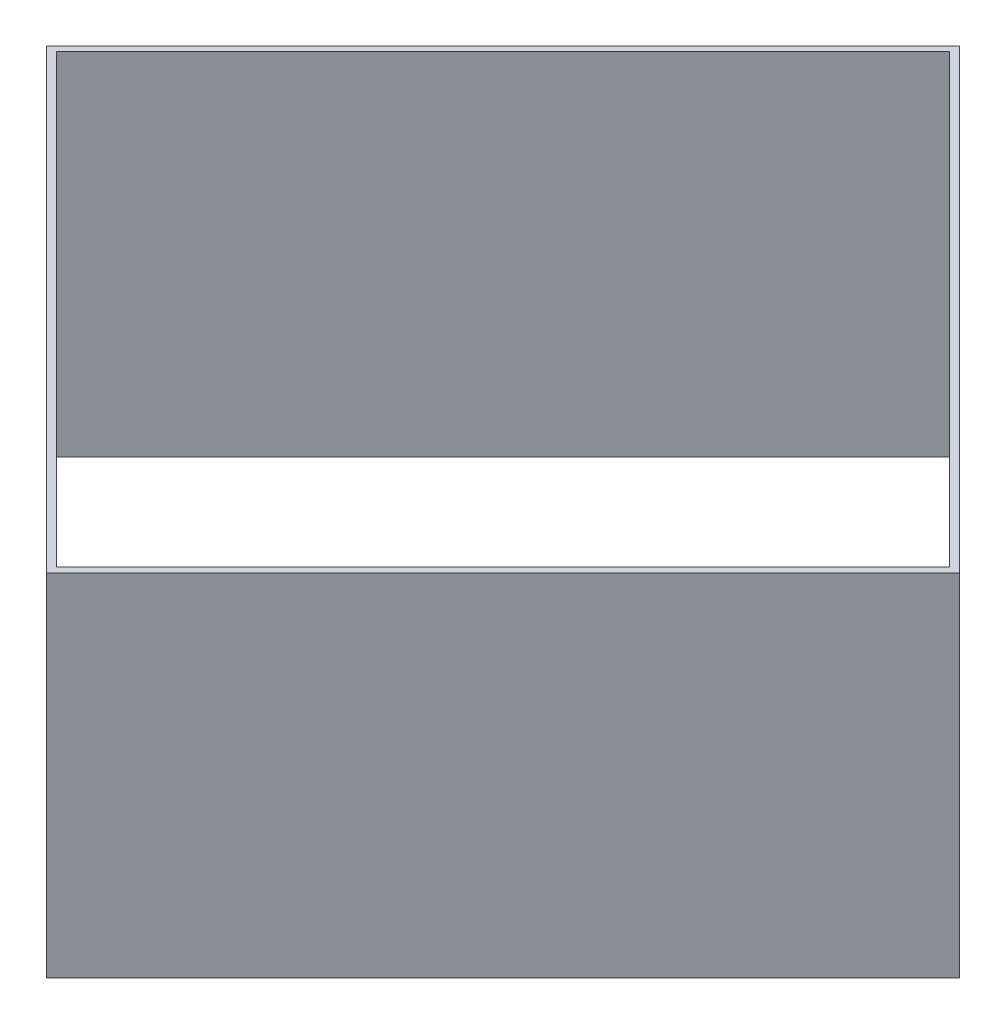
ISO-10303-21;
HEADER;
FILE_DESCRIPTION(('STEP AP214'),'2;1');
FILE_NAME('part.step','',(''),(''),'','','');
FILE_SCHEMA(('AUTOMOTIVE_DESIGN { 1 0 10303 214 1 1 1 1 }'));
ENDSEC;
DATA;
#1=APPLICATION_CONTEXT('core data for automotive mechanical design processes');
#2=APPLICATION_PROTOCOL_DEFINITION('international standard','automotive_design',2000,#1);
#3=PRODUCT_CONTEXT('',#1,'mechanical');
#4=PRODUCT('Part','Part','',(#3));
#5=PRODUCT_RELATED_PRODUCT_CATEGORY('part','',(#4));
#6=PRODUCT_DEFINITION_FORMATION('','',#4);
#7=PRODUCT_DEFINITION_CONTEXT('part definition',#1,'design');
#8=PRODUCT_DEFINITION('design','',#6,#7);
#9=PRODUCT_DEFINITION_SHAPE('','',#8);
#10=(LENGTH_UNIT() NAMED_UNIT(*) SI_UNIT(.MILLI.,.METRE.));
#11=(NAMED_UNIT(*) PLANE_ANGLE_UNIT() SI_UNIT($,.RADIAN.));
#12=(NAMED_UNIT(*) SI_UNIT($,.STERADIAN.) SOLID_ANGLE_UNIT());
#13=UNCERTAINTY_MEASURE_WITH_UNIT(LENGTH_MEASURE(1.E-05),#10,'distance_accuracy_value','');
#14=(GEOMETRIC_REPRESENTATION_CONTEXT(3) GLOBAL_UNCERTAINTY_ASSIGNED_CONTEXT((#13)) GLOBAL_UNIT_ASSIGNED_CONTEXT((#10,
#11,#12)) REPRESENTATION_CONTEXT('',''));
#15=CARTESIAN_POINT('',(0.,0.,0.));
#16=DIRECTION('',(0.,0.,1.));
#17=DIRECTION('',(1.,0.,0.));
#18=AXIS2_PLACEMENT_3D('',#15,#16,#17);
#19=CARTESIAN_POINT('',(0.,10.,0.));
#20=DIRECTION('',(0.,1.,0.));
#21=DIRECTION('',(0.,0.,1.));
#22=AXIS2_PLACEMENT_3D('',#19,#20,#21);
#23=PLANE('',#22);
#24=DIRECTION('',(0.707106781186547,0.,-0.707106781186548));
#25=VECTOR('',#24,1.);
#26=CARTESIAN_POINT('',(0.14142135623731,10.,12.8693434175952));
#27=LINE('',#26,#25);
#28=CARTESIAN_POINT('',(0.,10.,13.0107647738325));
#29=VERTEX_POINT('',#28);
#30=CARTESIAN_POINT('',(13.0107647738325,10.,0.));
#31=VERTEX_POINT('',#30);
#32=EDGE_CURVE('E160',#29,#31,#27,.T.);
#33=ORIENTED_EDGE('',*,*,#32,.T.);
#34=DIRECTION('',(-0.707106781186548,0.,-0.707106781186547));
#35=VECTOR('',#34,1.);
#36=CARTESIAN_POINT('',(12.8693434175952,10.,-0.141421356237309));
#37=LINE('',#36,#35);
#38=CARTESIAN_POINT('',(0.,10.,-13.0107647738325));
#39=VERTEX_POINT('',#38);
#40=EDGE_CURVE('E163',#31,#39,#37,.T.);
#41=ORIENTED_EDGE('',*,*,#40,.T.);
#42=DIRECTION('',(-0.707106781186548,0.,0.707106781186547));
#43=VECTOR('',#42,1.);
#44=CARTESIAN_POINT('',(-12.8693434175952,10.,-0.141421356237309));
#45=LINE('',#44,#43);
#46=CARTESIAN_POINT('',(-13.0107647738325,10.,0.));
#47=VERTEX_POINT('',#46);
#48=EDGE_CURVE('E166',#39,#47,#45,.T.);
#49=ORIENTED_EDGE('',*,*,#48,.T.);
#50=DIRECTION('',(0.707106781186547,0.,0.707106781186548));
#51=VECTOR('',#50,1.);
#52=CARTESIAN_POINT('',(-0.141421356237309,10.,12.8693434175952));
#53=LINE('',#52,#51);
#54=EDGE_CURVE('E168',#47,#29,#53,.T.);
#55=ORIENTED_EDGE('',*,*,#54,.T.);
#56=EDGE_LOOP('',(#33,#41,#49,#55));
#57=FACE_BOUND('',#56,.T.);
#58=DIRECTION('',(-0.707106781186548,0.,-0.707106781186548));
#59=VECTOR('',#58,1.);
#60=CARTESIAN_POINT('',(12.7279220613579,10.,0.));
#61=LINE('',#60,#59);
#62=CARTESIAN_POINT('',(12.7279220613579,10.,0.));
#63=VERTEX_POINT('',#62);
#64=CARTESIAN_POINT('',(0.,10.,-12.7279220613579));
#65=VERTEX_POINT('',#64);
#66=EDGE_CURVE('E132',#63,#65,#61,.T.);
#67=ORIENTED_EDGE('',*,*,#66,.F.);
#68=DIRECTION('',(0.707106781186547,0.,-0.707106781186548));
#69=VECTOR('',#68,1.);
#70=CARTESIAN_POINT('',(0.,10.,12.7279220613579));
#71=LINE('',#70,#69);
#72=CARTESIAN_POINT('',(0.,10.,12.7279220613579));
#73=VERTEX_POINT('',#72);
#74=EDGE_CURVE('E124',#73,#63,#71,.T.);
#75=ORIENTED_EDGE('',*,*,#74,.F.);
#76=DIRECTION('',(0.707106781186548,0.,0.707106781186548));
#77=VECTOR('',#76,1.);
#78=CARTESIAN_POINT('',(0.,10.,12.7279220613579));
#79=LINE('',#78,#77);
#80=CARTESIAN_POINT('',(-12.7279220613579,10.,0.));
#81=VERTEX_POINT('',#80);
#82=EDGE_CURVE('E146',#81,#73,#79,.T.);
#83=ORIENTED_EDGE('',*,*,#82,.F.);
#84=DIRECTION('',(-0.707106781186548,0.,0.707106781186547));
#85=VECTOR('',#84,1.);
#86=CARTESIAN_POINT('',(-12.7279220613579,10.,0.));
#87=LINE('',#86,#85);
#88=EDGE_CURVE('E144',#65,#81,#87,.T.);
#89=ORIENTED_EDGE('',*,*,#88,.F.);
#90=EDGE_LOOP('',(#67,#75,#83,#89));
#91=FACE_BOUND('',#90,.T.);
#92=ADVANCED_FACE('F59',(#57,#91),#23,.T.);
#93=CARTESIAN_POINT('',(0.,0.,0.));
#94=DIRECTION('',(0.,1.,0.));
#95=DIRECTION('',(0.,0.,1.));
#96=AXIS2_PLACEMENT_3D('',#93,#94,#95);
#97=PLANE('',#96);
#98=DIRECTION('',(0.707106781186547,0.,-0.707106781186548));
#99=VECTOR('',#98,1.);
#100=CARTESIAN_POINT('',(0.14142135623731,0.,12.8693434175952));
#101=LINE('',#100,#99);
#102=CARTESIAN_POINT('',(0.,0.,13.0107647738325));
#103=VERTEX_POINT('',#102);
#104=CARTESIAN_POINT('',(13.0107647738325,0.,0.));
#105=VERTEX_POINT('',#104);
#106=EDGE_CURVE('E140',#103,#105,#101,.T.);
#107=ORIENTED_EDGE('',*,*,#106,.F.);
#108=DIRECTION('',(0.707106781186547,0.,0.707106781186548));
#109=VECTOR('',#108,1.);
#110=CARTESIAN_POINT('',(-0.141421356237309,0.,12.8693434175952));
#111=LINE('',#110,#109);
#112=CARTESIAN_POINT('',(-13.0107647738325,0.,0.));
#113=VERTEX_POINT('',#112);
#114=EDGE_CURVE('E164',#113,#103,#111,.T.);
#115=ORIENTED_EDGE('',*,*,#114,.F.);
#116=DIRECTION('',(-0.707106781186548,0.,0.707106781186547));
#117=VECTOR('',#116,1.);
#118=CARTESIAN_POINT('',(-12.8693434175952,0.,-0.141421356237309));
#119=LINE('',#118,#117);
#120=CARTESIAN_POINT('',(0.,0.,-13.0107647738325));
#121=VERTEX_POINT('',#120);
#122=EDGE_CURVE('E175',#121,#113,#119,.T.);
#123=ORIENTED_EDGE('',*,*,#122,.F.);
#124=DIRECTION('',(-0.707106781186548,0.,-0.707106781186547));
#125=VECTOR('',#124,1.);
#126=CARTESIAN_POINT('',(12.8693434175952,0.,-0.141421356237309));
#127=LINE('',#126,#125);
#128=EDGE_CURVE('E173',#105,#121,#127,.T.);
#129=ORIENTED_EDGE('',*,*,#128,.F.);
#130=EDGE_LOOP('',(#107,#115,#123,#129));
#131=FACE_BOUND('',#130,.T.);
#132=DIRECTION('',(0.707106781186547,0.,-0.707106781186548));
#133=VECTOR('',#132,1.);
#134=CARTESIAN_POINT('',(0.,0.,12.7279220613579));
#135=LINE('',#134,#133);
#136=CARTESIAN_POINT('',(0.,0.,12.7279220613579));
#137=VERTEX_POINT('',#136);
#138=CARTESIAN_POINT('',(12.7279220613579,0.,0.));
#139=VERTEX_POINT('',#138);
#140=EDGE_CURVE('E82',#137,#139,#135,.T.);
#141=ORIENTED_EDGE('',*,*,#140,.T.);
#142=DIRECTION('',(-0.707106781186548,0.,-0.707106781186548));
#143=VECTOR('',#142,1.);
#144=CARTESIAN_POINT('',(12.7279220613579,0.,0.));
#145=LINE('',#144,#143);
#146=CARTESIAN_POINT('',(0.,0.,-12.7279220613579));
#147=VERTEX_POINT('',#146);
#148=EDGE_CURVE('E139',#139,#147,#145,.T.);
#149=ORIENTED_EDGE('',*,*,#148,.T.);
#150=DIRECTION('',(-0.707106781186548,0.,0.707106781186547));
#151=VECTOR('',#150,1.);
#152=CARTESIAN_POINT('',(-12.7279220613579,0.,0.));
#153=LINE('',#152,#151);
#154=CARTESIAN_POINT('',(-12.7279220613579,0.,0.));
#155=VERTEX_POINT('',#154);
#156=EDGE_CURVE('E152',#147,#155,#153,.T.);
#157=ORIENTED_EDGE('',*,*,#156,.T.);
#158=DIRECTION('',(0.707106781186548,0.,0.707106781186548));
#159=VECTOR('',#158,1.);
#160=CARTESIAN_POINT('',(0.,0.,12.7279220613579));
#161=LINE('',#160,#159);
#162=EDGE_CURVE('E133',#155,#137,#161,.T.);
#163=ORIENTED_EDGE('',*,*,#162,.T.);
#164=EDGE_LOOP('',(#141,#149,#157,#163));
#165=FACE_BOUND('',#164,.T.);
#166=ADVANCED_FACE('F193',(#131,#165),#97,.F.);
#167=CARTESIAN_POINT('',(0.14142135623731,10.,12.8693434175952));
#168=DIRECTION('',(-0.707106781186548,0.,-0.707106781186547));
#169=DIRECTION('',(-0.707106781186547,0.,0.707106781186548));
#170=AXIS2_PLACEMENT_3D('',#167,#168,#169);
#171=PLANE('',#170);
#172=ORIENTED_EDGE('',*,*,#106,.T.);
#173=DIRECTION('',(0.,-1.,0.));
#174=VECTOR('',#173,1.);
#175=CARTESIAN_POINT('',(13.0107647738325,10.,0.));
#176=LINE('',#175,#174);
#177=EDGE_CURVE('E12',#31,#105,#176,.T.);
#178=ORIENTED_EDGE('',*,*,#177,.F.);
#179=ORIENTED_EDGE('',*,*,#32,.F.);
#180=DIRECTION('',(0.,-1.,0.));
#181=VECTOR('',#180,1.);
#182=CARTESIAN_POINT('',(0.,10.,13.0107647738325));
#183=LINE('',#182,#181);
#184=EDGE_CURVE('E170',#29,#103,#183,.T.);
#185=ORIENTED_EDGE('',*,*,#184,.T.);
#186=EDGE_LOOP('',(#172,#178,#179,#185));
#187=FACE_BOUND('',#186,.T.);
#188=ADVANCED_FACE('F61',(#187),#171,.F.);
#189=CARTESIAN_POINT('',(12.8693434175952,10.,-0.141421356237309));
#190=DIRECTION('',(-0.707106781186547,0.,0.707106781186548));
#191=DIRECTION('',(0.707106781186548,0.,0.707106781186547));
#192=AXIS2_PLACEMENT_3D('',#189,#190,#191);
#193=PLANE('',#192);
#194=ORIENTED_EDGE('',*,*,#128,.T.);
#195=DIRECTION('',(0.,-1.,0.));
#196=VECTOR('',#195,1.);
#197=CARTESIAN_POINT('',(0.,10.,-13.0107647738325));
#198=LINE('',#197,#196);
#199=EDGE_CURVE('E67',#39,#121,#198,.T.);
#200=ORIENTED_EDGE('',*,*,#199,.F.);
#201=ORIENTED_EDGE('',*,*,#40,.F.);
#202=ORIENTED_EDGE('',*,*,#177,.T.);
#203=EDGE_LOOP('',(#194,#200,#201,#202));
#204=FACE_BOUND('',#203,.T.);
#205=ADVANCED_FACE('F203',(#204),#193,.F.);
#206=CARTESIAN_POINT('',(-12.8693434175952,10.,-0.141421356237309));
#207=DIRECTION('',(0.707106781186547,0.,0.707106781186548));
#208=DIRECTION('',(0.707106781186548,0.,-0.707106781186547));
#209=AXIS2_PLACEMENT_3D('',#206,#207,#208);
#210=PLANE('',#209);
#211=ORIENTED_EDGE('',*,*,#122,.T.);
#212=DIRECTION('',(0.,-1.,0.));
#213=VECTOR('',#212,1.);
#214=CARTESIAN_POINT('',(-13.0107647738325,10.,0.));
#215=LINE('',#214,#213);
#216=EDGE_CURVE('E180',#47,#113,#215,.T.);
#217=ORIENTED_EDGE('',*,*,#216,.F.);
#218=ORIENTED_EDGE('',*,*,#48,.F.);
#219=ORIENTED_EDGE('',*,*,#199,.T.);
#220=EDGE_LOOP('',(#211,#217,#218,#219));
#221=FACE_BOUND('',#220,.T.);
#222=ADVANCED_FACE('F187',(#221),#210,.F.);
#223=CARTESIAN_POINT('',(-0.141421356237309,10.,12.8693434175952));
#224=DIRECTION('',(0.707106781186548,0.,-0.707106781186547));
#225=DIRECTION('',(-0.707106781186547,0.,-0.707106781186548));
#226=AXIS2_PLACEMENT_3D('',#223,#224,#225);
#227=PLANE('',#226);
#228=ORIENTED_EDGE('',*,*,#114,.T.);
#229=ORIENTED_EDGE('',*,*,#184,.F.);
#230=ORIENTED_EDGE('',*,*,#54,.F.);
#231=ORIENTED_EDGE('',*,*,#216,.T.);
#232=EDGE_LOOP('',(#228,#229,#230,#231));
#233=FACE_BOUND('',#232,.T.);
#234=ADVANCED_FACE('F197',(#233),#227,.F.);
#235=CARTESIAN_POINT('',(0.,10.,12.7279220613579));
#236=DIRECTION('',(-0.707106781186548,0.,-0.707106781186547));
#237=DIRECTION('',(-0.707106781186547,0.,0.707106781186548));
#238=AXIS2_PLACEMENT_3D('',#235,#236,#237);
#239=PLANE('',#238);
#240=ORIENTED_EDGE('',*,*,#140,.F.);
#241=DIRECTION('',(0.,-1.,0.));
#242=VECTOR('',#241,1.);
#243=CARTESIAN_POINT('',(0.,10.,12.7279220613579));
#244=LINE('',#243,#242);
#245=EDGE_CURVE('E128',#73,#137,#244,.T.);
#246=ORIENTED_EDGE('',*,*,#245,.F.);
#247=ORIENTED_EDGE('',*,*,#74,.T.);
#248=DIRECTION('',(0.,-1.,0.));
#249=VECTOR('',#248,1.);
#250=CARTESIAN_POINT('',(12.7279220613579,10.,0.));
#251=LINE('',#250,#249);
#252=EDGE_CURVE('E127',#63,#139,#251,.T.);
#253=ORIENTED_EDGE('',*,*,#252,.T.);
#254=EDGE_LOOP('',(#240,#246,#247,#253));
#255=FACE_BOUND('',#254,.T.);
#256=ADVANCED_FACE('F126',(#255),#239,.T.);
#257=CARTESIAN_POINT('',(12.7279220613579,10.,0.));
#258=DIRECTION('',(-0.707106781186548,0.,0.707106781186548));
#259=DIRECTION('',(0.707106781186548,0.,0.707106781186548));
#260=AXIS2_PLACEMENT_3D('',#257,#258,#259);
#261=PLANE('',#260);
#262=ORIENTED_EDGE('',*,*,#148,.F.);
#263=ORIENTED_EDGE('',*,*,#252,.F.);
#264=ORIENTED_EDGE('',*,*,#66,.T.);
#265=DIRECTION('',(0.,-1.,0.));
#266=VECTOR('',#265,1.);
#267=CARTESIAN_POINT('',(0.,10.,-12.7279220613579));
#268=LINE('',#267,#266);
#269=EDGE_CURVE('E141',#65,#147,#268,.T.);
#270=ORIENTED_EDGE('',*,*,#269,.T.);
#271=EDGE_LOOP('',(#262,#263,#264,#270));
#272=FACE_BOUND('',#271,.T.);
#273=ADVANCED_FACE('F136',(#272),#261,.T.);
#274=CARTESIAN_POINT('',(-12.7279220613579,10.,0.));
#275=DIRECTION('',(0.707106781186547,0.,0.707106781186548));
#276=DIRECTION('',(0.707106781186548,0.,-0.707106781186547));
#277=AXIS2_PLACEMENT_3D('',#274,#275,#276);
#278=PLANE('',#277);
#279=ORIENTED_EDGE('',*,*,#156,.F.);
#280=ORIENTED_EDGE('',*,*,#269,.F.);
#281=ORIENTED_EDGE('',*,*,#88,.T.);
#282=DIRECTION('',(0.,-1.,0.));
#283=VECTOR('',#282,1.);
#284=CARTESIAN_POINT('',(-12.7279220613579,10.,0.));
#285=LINE('',#284,#283);
#286=EDGE_CURVE('E74',#81,#155,#285,.T.);
#287=ORIENTED_EDGE('',*,*,#286,.T.);
#288=EDGE_LOOP('',(#279,#280,#281,#287));
#289=FACE_BOUND('',#288,.T.);
#290=ADVANCED_FACE('F226',(#289),#278,.T.);
#291=CARTESIAN_POINT('',(0.,10.,12.7279220613579));
#292=DIRECTION('',(0.707106781186548,0.,-0.707106781186548));
#293=DIRECTION('',(-0.707106781186548,0.,-0.707106781186548));
#294=AXIS2_PLACEMENT_3D('',#291,#292,#293);
#295=PLANE('',#294);
#296=ORIENTED_EDGE('',*,*,#162,.F.);
#297=ORIENTED_EDGE('',*,*,#286,.F.);
#298=ORIENTED_EDGE('',*,*,#82,.T.);
#299=ORIENTED_EDGE('',*,*,#245,.T.);
#300=EDGE_LOOP('',(#296,#297,#298,#299));
#301=FACE_BOUND('',#300,.T.);
#302=ADVANCED_FACE('F230',(#301),#295,.T.);
#303=CLOSED_SHELL('',(#92,#166,#188,#205,#222,#234,#256,#273,#290,#302));
#304=MANIFOLD_SOLID_BREP('B2',#303);
#305=ADVANCED_BREP_SHAPE_REPRESENTATION('',(#18,#304),#14);
#306=SHAPE_DEFINITION_REPRESENTATION(#9,#305);
ENDSEC;
END-ISO-10303-21;
